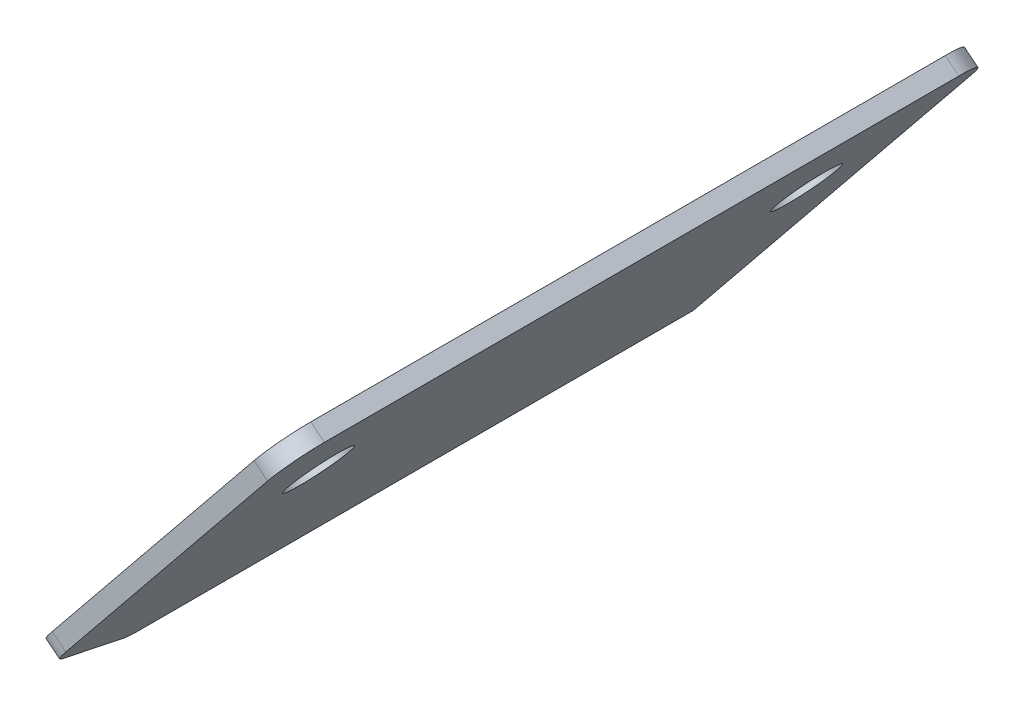
ISO-10303-21;
HEADER;
FILE_DESCRIPTION(('STEP AP214'),'2;1');
FILE_NAME('part.step','',(''),(''),'','','');
FILE_SCHEMA(('AUTOMOTIVE_DESIGN { 1 0 10303 214 1 1 1 1 }'));
ENDSEC;
DATA;
#1=APPLICATION_CONTEXT('core data for automotive mechanical design processes');
#2=APPLICATION_PROTOCOL_DEFINITION('international standard','automotive_design',2000,#1);
#3=PRODUCT_CONTEXT('',#1,'mechanical');
#4=PRODUCT('Part','Part','',(#3));
#5=PRODUCT_RELATED_PRODUCT_CATEGORY('part','',(#4));
#6=PRODUCT_DEFINITION_FORMATION('','',#4);
#7=PRODUCT_DEFINITION_CONTEXT('part definition',#1,'design');
#8=PRODUCT_DEFINITION('design','',#6,#7);
#9=PRODUCT_DEFINITION_SHAPE('','',#8);
#10=(LENGTH_UNIT() NAMED_UNIT(*) SI_UNIT(.MILLI.,.METRE.));
#11=(NAMED_UNIT(*) PLANE_ANGLE_UNIT() SI_UNIT($,.RADIAN.));
#12=(NAMED_UNIT(*) SI_UNIT($,.STERADIAN.) SOLID_ANGLE_UNIT());
#13=UNCERTAINTY_MEASURE_WITH_UNIT(LENGTH_MEASURE(1.E-05),#10,'distance_accuracy_value','');
#14=(GEOMETRIC_REPRESENTATION_CONTEXT(3) GLOBAL_UNCERTAINTY_ASSIGNED_CONTEXT((#13)) GLOBAL_UNIT_ASSIGNED_CONTEXT((#10,
#11,#12)) REPRESENTATION_CONTEXT('',''));
#15=CARTESIAN_POINT('',(0.,0.,0.));
#16=DIRECTION('',(0.,0.,1.));
#17=DIRECTION('',(1.,0.,0.));
#18=AXIS2_PLACEMENT_3D('',#15,#16,#17);
#19=CARTESIAN_POINT('',(-558.37934362098,-537.063221552795,436.626976517199));
#20=DIRECTION('',(0.77686385777956,-0.629668600516065,0.));
#21=DIRECTION('',(0.629668600516065,0.77686385777956,0.));
#22=AXIS2_PLACEMENT_3D('',#19,#20,#21);
#23=PLANE('',#22);
#24=CARTESIAN_POINT('',(-480.886180273954,-441.454773267503,213.995));
#25=DIRECTION('',(-0.77686385777956,0.629668600516065,0.));
#26=DIRECTION('',(-0.629668600516065,-0.77686385777956,0.));
#27=AXIS2_PLACEMENT_3D('',#24,#25,#26);
#28=CIRCLE('',#27,11.1125000000001);
#29=CARTESIAN_POINT('',(-487.883372597189,-450.087672887079,213.995));
#30=VERTEX_POINT('',#29);
#31=EDGE_CURVE('E320',#30,#30,#28,.T.);
#32=ORIENTED_EDGE('',*,*,#31,.F.);
#33=EDGE_LOOP('',(#32));
#34=FACE_BOUND('',#33,.T.);
#35=CARTESIAN_POINT('',(-480.886180273954,-441.454773267503,36.195));
#36=DIRECTION('',(-0.77686385777956,0.629668600516065,0.));
#37=DIRECTION('',(-0.629668600516065,-0.77686385777956,0.));
#38=AXIS2_PLACEMENT_3D('',#35,#36,#37);
#39=CIRCLE('',#38,11.1125000000001);
#40=CARTESIAN_POINT('',(-487.883372597189,-450.087672887079,36.195));
#41=VERTEX_POINT('',#40);
#42=EDGE_CURVE('E185',#41,#41,#39,.T.);
#43=ORIENTED_EDGE('',*,*,#42,.F.);
#44=EDGE_LOOP('',(#43));
#45=FACE_BOUND('',#44,.T.);
#46=DIRECTION('',(0.,0.,-1.));
#47=VECTOR('',#46,1.);
#48=CARTESIAN_POINT('',(-448.899015367738,-401.990089292302,436.626976517199));
#49=LINE('',#48,#47);
#50=CARTESIAN_POINT('',(-448.899015367738,-401.990089292302,243.84));
#51=VERTEX_POINT('',#50);
#52=CARTESIAN_POINT('',(-448.899015367738,-401.990089292302,12.7));
#53=VERTEX_POINT('',#52);
#54=EDGE_CURVE('E140',#51,#53,#49,.T.);
#55=ORIENTED_EDGE('',*,*,#54,.T.);
#56=CARTESIAN_POINT('',(-456.895806594292,-411.856260286102,12.7));
#57=DIRECTION('',(0.77686385777956,-0.629668600516065,0.));
#58=DIRECTION('',(0.629668600516065,0.77686385777956,0.));
#59=AXIS2_PLACEMENT_3D('',#56,#57,#58);
#60=CIRCLE('',#59,12.7);
#61=CARTESIAN_POINT('',(-456.895806594292,-411.856260286102,0.));
#62=VERTEX_POINT('',#61);
#63=EDGE_CURVE('E160',#53,#62,#60,.F.);
#64=ORIENTED_EDGE('',*,*,#63,.T.);
#65=DIRECTION('',(-0.629668600516065,-0.77686385777956,0.));
#66=VECTOR('',#65,1.);
#67=CARTESIAN_POINT('',(-558.37934362098,-537.063221552795,0.));
#68=LINE('',#67,#66);
#69=CARTESIAN_POINT('',(-558.37934362098,-537.063221552795,0.));
#70=VERTEX_POINT('',#69);
#71=EDGE_CURVE('E138',#62,#70,#68,.T.);
#72=ORIENTED_EDGE('',*,*,#71,.T.);
#73=DIRECTION('',(0.,0.,-1.));
#74=VECTOR('',#73,1.);
#75=CARTESIAN_POINT('',(-558.37934362098,-537.063221552795,436.626976517199));
#76=LINE('',#75,#74);
#77=CARTESIAN_POINT('',(-558.37934362098,-537.063221552795,201.506666666667));
#78=VERTEX_POINT('',#77);
#79=EDGE_CURVE('E122',#78,#70,#76,.T.);
#80=ORIENTED_EDGE('',*,*,#79,.F.);
#81=CARTESIAN_POINT('',(-550.382552394426,-527.197050558995,201.506666666667));
#82=DIRECTION('',(0.77686385777956,-0.629668600516065,0.));
#83=DIRECTION('',(0.629668600516065,0.77686385777956,0.));
#84=AXIS2_PLACEMENT_3D('',#81,#82,#83);
#85=CIRCLE('',#84,12.7);
#86=CARTESIAN_POINT('',(-556.779985375669,-535.089987354035,209.126666666667));
#87=VERTEX_POINT('',#86);
#88=EDGE_CURVE('E154',#78,#87,#85,.F.);
#89=ORIENTED_EDGE('',*,*,#88,.T.);
#90=DIRECTION('',(-0.377801160309639,-0.466118314667735,-0.800000000000001));
#91=VECTOR('',#90,1.);
#92=CARTESIAN_POINT('',(-488.595849518114,-450.966702854454,353.507664971008));
#93=LINE('',#92,#91);
#94=CARTESIAN_POINT('',(-536.788007309284,-510.424559869534,251.46));
#95=VERTEX_POINT('',#94);
#96=EDGE_CURVE('E179',#95,#87,#93,.T.);
#97=ORIENTED_EDGE('',*,*,#96,.F.);
#98=CARTESIAN_POINT('',(-530.390574328041,-502.531623074494,243.84));
#99=DIRECTION('',(0.77686385777956,-0.629668600516065,0.));
#100=DIRECTION('',(0.629668600516065,0.77686385777956,0.));
#101=AXIS2_PLACEMENT_3D('',#98,#99,#100);
#102=CIRCLE('',#101,12.7);
#103=CARTESIAN_POINT('',(-530.390574328041,-502.531623074493,256.54));
#104=VERTEX_POINT('',#103);
#105=EDGE_CURVE('E156',#95,#104,#102,.F.);
#106=ORIENTED_EDGE('',*,*,#105,.T.);
#107=DIRECTION('',(-0.629668600516065,-0.77686385777956,0.));
#108=VECTOR('',#107,1.);
#109=CARTESIAN_POINT('',(-558.37934362098,-537.063221552795,256.54));
#110=LINE('',#109,#108);
#111=CARTESIAN_POINT('',(-456.895806594292,-411.856260286102,256.54));
#112=VERTEX_POINT('',#111);
#113=EDGE_CURVE('E132',#112,#104,#110,.T.);
#114=ORIENTED_EDGE('',*,*,#113,.F.);
#115=CARTESIAN_POINT('',(-456.895806594292,-411.856260286102,243.84));
#116=DIRECTION('',(0.77686385777956,-0.629668600516065,0.));
#117=DIRECTION('',(0.629668600516065,0.77686385777956,0.));
#118=AXIS2_PLACEMENT_3D('',#115,#116,#117);
#119=CIRCLE('',#118,12.7);
#120=EDGE_CURVE('E158',#112,#51,#119,.F.);
#121=ORIENTED_EDGE('',*,*,#120,.T.);
#122=EDGE_LOOP('',(#55,#64,#72,#80,#89,#97,#106,#114,#121));
#123=FACE_BOUND('',#122,.T.);
#124=ADVANCED_FACE('F33',(#34,#45,#123),#23,.F.);
#125=CARTESIAN_POINT('',(-553.44625812408,-541.061617166072,436.626976517199));
#126=DIRECTION('',(0.629668600516064,0.77686385777956,0.));
#127=DIRECTION('',(-0.77686385777956,0.629668600516064,0.));
#128=AXIS2_PLACEMENT_3D('',#125,#126,#127);
#129=PLANE('',#128);
#130=DIRECTION('',(0.,0.,-1.));
#131=VECTOR('',#130,1.);
#132=CARTESIAN_POINT('',(-553.44625812408,-541.061617166072,436.626976517199));
#133=LINE('',#132,#131);
#134=CARTESIAN_POINT('',(-553.44625812408,-541.061617166072,201.506666666667));
#135=VERTEX_POINT('',#134);
#136=CARTESIAN_POINT('',(-553.44625812408,-541.061617166072,0.));
#137=VERTEX_POINT('',#136);
#138=EDGE_CURVE('E106',#135,#137,#133,.T.);
#139=ORIENTED_EDGE('',*,*,#138,.F.);
#140=DIRECTION('',(-0.77686385777956,0.629668600516064,0.));
#141=VECTOR('',#140,1.);
#142=CARTESIAN_POINT('',(-558.37934362098,-537.063221552795,201.506666666667));
#143=LINE('',#142,#141);
#144=EDGE_CURVE('E11',#135,#78,#143,.T.);
#145=ORIENTED_EDGE('',*,*,#144,.T.);
#146=ORIENTED_EDGE('',*,*,#79,.T.);
#147=DIRECTION('',(0.77686385777956,-0.629668600516064,0.));
#148=VECTOR('',#147,1.);
#149=CARTESIAN_POINT('',(-553.44625812408,-541.061617166072,0.));
#150=LINE('',#149,#148);
#151=EDGE_CURVE('E117',#70,#137,#150,.T.);
#152=ORIENTED_EDGE('',*,*,#151,.T.);
#153=EDGE_LOOP('',(#139,#145,#146,#152));
#154=FACE_BOUND('',#153,.T.);
#155=ADVANCED_FACE('F120',(#154),#129,.F.);
#156=CARTESIAN_POINT('',(-443.965929870837,-405.988484905579,436.626976517199));
#157=DIRECTION('',(-0.77686385777956,0.629668600516065,0.));
#158=DIRECTION('',(-0.629668600516065,-0.77686385777956,0.));
#159=AXIS2_PLACEMENT_3D('',#156,#157,#158);
#160=PLANE('',#159);
#161=CARTESIAN_POINT('',(-475.953094777053,-445.45316888078,213.995));
#162=DIRECTION('',(-0.77686385777956,0.629668600516065,0.));
#163=DIRECTION('',(-0.629668600516065,-0.77686385777956,0.));
#164=AXIS2_PLACEMENT_3D('',#161,#162,#163);
#165=CIRCLE('',#164,11.1125000000001);
#166=CARTESIAN_POINT('',(-482.950287100288,-454.086068500356,213.995));
#167=VERTEX_POINT('',#166);
#168=EDGE_CURVE('E135',#167,#167,#165,.F.);
#169=ORIENTED_EDGE('',*,*,#168,.F.);
#170=EDGE_LOOP('',(#169));
#171=FACE_BOUND('',#170,.T.);
#172=CARTESIAN_POINT('',(-475.953094777053,-445.45316888078,36.195));
#173=DIRECTION('',(-0.77686385777956,0.629668600516065,0.));
#174=DIRECTION('',(-0.629668600516065,-0.77686385777956,0.));
#175=AXIS2_PLACEMENT_3D('',#172,#173,#174);
#176=CIRCLE('',#175,11.1125000000001);
#177=CARTESIAN_POINT('',(-482.950287100288,-454.086068500356,36.195));
#178=VERTEX_POINT('',#177);
#179=EDGE_CURVE('E319',#178,#178,#176,.F.);
#180=ORIENTED_EDGE('',*,*,#179,.F.);
#181=EDGE_LOOP('',(#180));
#182=FACE_BOUND('',#181,.T.);
#183=DIRECTION('',(0.629668600516065,0.77686385777956,0.));
#184=VECTOR('',#183,1.);
#185=CARTESIAN_POINT('',(-443.965929870837,-405.988484905579,0.));
#186=LINE('',#185,#184);
#187=CARTESIAN_POINT('',(-451.962721097391,-415.854655899379,0.));
#188=VERTEX_POINT('',#187);
#189=EDGE_CURVE('E110',#137,#188,#186,.T.);
#190=ORIENTED_EDGE('',*,*,#189,.T.);
#191=CARTESIAN_POINT('',(-451.962721097391,-415.854655899379,12.7));
#192=DIRECTION('',(-0.77686385777956,0.629668600516065,0.));
#193=DIRECTION('',(-0.629668600516065,-0.77686385777956,0.));
#194=AXIS2_PLACEMENT_3D('',#191,#192,#193);
#195=CIRCLE('',#194,12.7);
#196=CARTESIAN_POINT('',(-443.965929870837,-405.988484905579,12.7));
#197=VERTEX_POINT('',#196);
#198=EDGE_CURVE('E166',#188,#197,#195,.F.);
#199=ORIENTED_EDGE('',*,*,#198,.T.);
#200=DIRECTION('',(0.,0.,-1.));
#201=VECTOR('',#200,1.);
#202=CARTESIAN_POINT('',(-443.965929870837,-405.988484905579,436.626976517199));
#203=LINE('',#202,#201);
#204=CARTESIAN_POINT('',(-443.965929870837,-405.988484905579,243.84));
#205=VERTEX_POINT('',#204);
#206=EDGE_CURVE('E146',#205,#197,#203,.T.);
#207=ORIENTED_EDGE('',*,*,#206,.F.);
#208=CARTESIAN_POINT('',(-451.962721097392,-415.854655899379,243.84));
#209=DIRECTION('',(-0.77686385777956,0.629668600516065,0.));
#210=DIRECTION('',(-0.629668600516065,-0.77686385777956,0.));
#211=AXIS2_PLACEMENT_3D('',#208,#209,#210);
#212=CIRCLE('',#211,12.7);
#213=CARTESIAN_POINT('',(-451.962721097392,-415.854655899379,256.54));
#214=VERTEX_POINT('',#213);
#215=EDGE_CURVE('E48',#205,#214,#212,.F.);
#216=ORIENTED_EDGE('',*,*,#215,.T.);
#217=DIRECTION('',(0.629668600516065,0.77686385777956,0.));
#218=VECTOR('',#217,1.);
#219=CARTESIAN_POINT('',(-443.965929870837,-405.988484905579,256.54));
#220=LINE('',#219,#218);
#221=CARTESIAN_POINT('',(-525.45748883114,-506.530018687771,256.54));
#222=VERTEX_POINT('',#221);
#223=EDGE_CURVE('E130',#222,#214,#220,.T.);
#224=ORIENTED_EDGE('',*,*,#223,.F.);
#225=CARTESIAN_POINT('',(-525.45748883114,-506.530018687771,243.84));
#226=DIRECTION('',(-0.77686385777956,0.629668600516065,0.));
#227=DIRECTION('',(-0.629668600516065,-0.77686385777956,0.));
#228=AXIS2_PLACEMENT_3D('',#225,#226,#227);
#229=CIRCLE('',#228,12.7);
#230=CARTESIAN_POINT('',(-531.854921812384,-514.422955482811,251.46));
#231=VERTEX_POINT('',#230);
#232=EDGE_CURVE('E56',#222,#231,#229,.F.);
#233=ORIENTED_EDGE('',*,*,#232,.T.);
#234=DIRECTION('',(0.377801160309639,0.466118314667735,0.800000000000001));
#235=VECTOR('',#234,1.);
#236=CARTESIAN_POINT('',(-444.249845850047,-406.338770853954,436.965149620054));
#237=LINE('',#236,#235);
#238=CARTESIAN_POINT('',(-551.846899878769,-539.088382967312,209.126666666667));
#239=VERTEX_POINT('',#238);
#240=EDGE_CURVE('E181',#239,#231,#237,.T.);
#241=ORIENTED_EDGE('',*,*,#240,.F.);
#242=CARTESIAN_POINT('',(-545.449466897526,-531.195446172272,201.506666666667));
#243=DIRECTION('',(-0.77686385777956,0.629668600516065,0.));
#244=DIRECTION('',(-0.629668600516065,-0.77686385777956,0.));
#245=AXIS2_PLACEMENT_3D('',#242,#243,#244);
#246=CIRCLE('',#245,12.7);
#247=EDGE_CURVE('E114',#239,#135,#246,.F.);
#248=ORIENTED_EDGE('',*,*,#247,.T.);
#249=ORIENTED_EDGE('',*,*,#138,.T.);
#250=EDGE_LOOP('',(#190,#199,#207,#216,#224,#233,#241,#248,#249));
#251=FACE_BOUND('',#250,.T.);
#252=ADVANCED_FACE('F108',(#171,#182,#251),#160,.F.);
#253=CARTESIAN_POINT('',(101.854,-3057.525,256.54));
#254=DIRECTION('',(0.,0.,1.));
#255=DIRECTION('',(0.,1.,0.));
#256=AXIS2_PLACEMENT_3D('',#253,#254,#255);
#257=PLANE('',#256);
#258=ORIENTED_EDGE('',*,*,#223,.T.);
#259=DIRECTION('',(-0.776863857779568,0.629668600516055,0.));
#260=VECTOR('',#259,1.);
#261=CARTESIAN_POINT('',(-456.895806594292,-411.856260286102,256.54));
#262=LINE('',#261,#260);
#263=EDGE_CURVE('E170',#214,#112,#262,.T.);
#264=ORIENTED_EDGE('',*,*,#263,.T.);
#265=ORIENTED_EDGE('',*,*,#113,.T.);
#266=DIRECTION('',(0.77686385777956,-0.629668600516065,0.));
#267=VECTOR('',#266,1.);
#268=CARTESIAN_POINT('',(1100.99793948235,-1824.8149447945,256.54));
#269=LINE('',#268,#267);
#270=EDGE_CURVE('E168',#104,#222,#269,.T.);
#271=ORIENTED_EDGE('',*,*,#270,.T.);
#272=EDGE_LOOP('',(#258,#264,#265,#271));
#273=FACE_BOUND('',#272,.T.);
#274=ADVANCED_FACE('F189',(#273),#257,.T.);
#275=CARTESIAN_POINT('',(-448.899015367738,-401.990089292302,436.626976517199));
#276=DIRECTION('',(-0.629668600516055,-0.776863857779568,0.));
#277=DIRECTION('',(0.776863857779568,-0.629668600516055,0.));
#278=AXIS2_PLACEMENT_3D('',#275,#276,#277);
#279=PLANE('',#278);
#280=ORIENTED_EDGE('',*,*,#206,.T.);
#281=DIRECTION('',(-0.776863857779568,0.629668600516055,0.));
#282=VECTOR('',#281,1.);
#283=CARTESIAN_POINT('',(-448.899015367738,-401.990089292302,12.7));
#284=LINE('',#283,#282);
#285=EDGE_CURVE('E151',#197,#53,#284,.T.);
#286=ORIENTED_EDGE('',*,*,#285,.T.);
#287=ORIENTED_EDGE('',*,*,#54,.F.);
#288=DIRECTION('',(-0.776863857779568,0.629668600516055,0.));
#289=VECTOR('',#288,1.);
#290=CARTESIAN_POINT('',(-443.965929870838,-405.988484905579,243.84));
#291=LINE('',#290,#289);
#292=EDGE_CURVE('E142',#51,#205,#291,.F.);
#293=ORIENTED_EDGE('',*,*,#292,.T.);
#294=EDGE_LOOP('',(#280,#286,#287,#293));
#295=FACE_BOUND('',#294,.T.);
#296=ADVANCED_FACE('F197',(#295),#279,.F.);
#297=CARTESIAN_POINT('',(-443.965929870837,-405.988484905579,0.));
#298=DIRECTION('',(0.,0.,-1.));
#299=DIRECTION('',(-1.,0.,0.));
#300=AXIS2_PLACEMENT_3D('',#297,#298,#299);
#301=PLANE('',#300);
#302=ORIENTED_EDGE('',*,*,#71,.F.);
#303=DIRECTION('',(-0.776863857779568,0.629668600516055,0.));
#304=VECTOR('',#303,1.);
#305=CARTESIAN_POINT('',(-451.962721097391,-415.854655899379,0.));
#306=LINE('',#305,#304);
#307=EDGE_CURVE('E129',#62,#188,#306,.F.);
#308=ORIENTED_EDGE('',*,*,#307,.T.);
#309=ORIENTED_EDGE('',*,*,#189,.F.);
#310=ORIENTED_EDGE('',*,*,#151,.F.);
#311=EDGE_LOOP('',(#302,#308,#309,#310));
#312=FACE_BOUND('',#311,.T.);
#313=ADVANCED_FACE('F127',(#312),#301,.T.);
#314=CARTESIAN_POINT('',(-409.878713174438,-499.008193969216,213.995));
#315=DIRECTION('',(-0.77686385777956,0.629668600516065,0.));
#316=DIRECTION('',(-0.629668600516065,-0.77686385777956,0.));
#317=AXIS2_PLACEMENT_3D('',#314,#315,#316);
#318=CYLINDRICAL_SURFACE('',#317,11.1125000000001);
#319=ORIENTED_EDGE('',*,*,#31,.T.);
#320=EDGE_LOOP('',(#319));
#321=FACE_BOUND('',#320,.T.);
#322=ORIENTED_EDGE('',*,*,#168,.T.);
#323=EDGE_LOOP('',(#322));
#324=FACE_BOUND('',#323,.T.);
#325=ADVANCED_FACE('F234',(#321,#324),#318,.F.);
#326=CARTESIAN_POINT('',(-409.878713174438,-499.008193969216,36.195));
#327=DIRECTION('',(-0.77686385777956,0.629668600516065,0.));
#328=DIRECTION('',(-0.629668600516065,-0.77686385777956,0.));
#329=AXIS2_PLACEMENT_3D('',#326,#327,#328);
#330=CYLINDRICAL_SURFACE('',#329,11.1125000000001);
#331=ORIENTED_EDGE('',*,*,#42,.T.);
#332=EDGE_LOOP('',(#331));
#333=FACE_BOUND('',#332,.T.);
#334=ORIENTED_EDGE('',*,*,#179,.T.);
#335=EDGE_LOOP('',(#334));
#336=FACE_BOUND('',#335,.T.);
#337=ADVANCED_FACE('F237',(#333,#336),#330,.F.);
#338=CARTESIAN_POINT('',(-249.071839619087,-787.765093217488,205.74));
#339=DIRECTION('',(-0.503734880412852,-0.621491086223648,0.599999999999999));
#340=DIRECTION('',(0.,-0.694558351611311,-0.719436373981034));
#341=AXIS2_PLACEMENT_3D('',#338,#339,#340);
#342=PLANE('',#341);
#343=ORIENTED_EDGE('',*,*,#240,.T.);
#344=DIRECTION('',(0.77686385777956,-0.629668600516065,0.));
#345=VECTOR('',#344,1.);
#346=CARTESIAN_POINT('',(-227.480503307391,-761.126431534226,251.46));
#347=LINE('',#346,#345);
#348=EDGE_CURVE('E41',#231,#95,#347,.F.);
#349=ORIENTED_EDGE('',*,*,#348,.T.);
#350=ORIENTED_EDGE('',*,*,#96,.T.);
#351=DIRECTION('',(-0.776863857779561,0.629668600516064,0.));
#352=VECTOR('',#351,1.);
#353=CARTESIAN_POINT('',(-551.846899878769,-539.088382967312,209.126666666667));
#354=LINE('',#353,#352);
#355=EDGE_CURVE('E173',#87,#239,#354,.F.);
#356=ORIENTED_EDGE('',*,*,#355,.T.);
#357=EDGE_LOOP('',(#343,#349,#350,#356));
#358=FACE_BOUND('',#357,.T.);
#359=ADVANCED_FACE('F178',(#358),#342,.T.);
#360=CARTESIAN_POINT('',(-456.895806594292,-411.856260286102,12.7));
#361=DIRECTION('',(0.776863857779568,-0.629668600516055,0.));
#362=DIRECTION('',(0.629668600516055,0.776863857779568,0.));
#363=AXIS2_PLACEMENT_3D('',#360,#361,#362);
#364=CYLINDRICAL_SURFACE('',#363,12.7);
#365=ORIENTED_EDGE('',*,*,#198,.F.);
#366=ORIENTED_EDGE('',*,*,#307,.F.);
#367=ORIENTED_EDGE('',*,*,#63,.F.);
#368=ORIENTED_EDGE('',*,*,#285,.F.);
#369=EDGE_LOOP('',(#365,#366,#367,#368));
#370=FACE_BOUND('',#369,.T.);
#371=ADVANCED_FACE('F194',(#370),#364,.T.);
#372=CARTESIAN_POINT('',(1174.4927072161,-1734.13958200607,243.84));
#373=DIRECTION('',(0.776863857779568,-0.629668600516055,0.));
#374=DIRECTION('',(0.629668600516055,0.776863857779568,0.));
#375=AXIS2_PLACEMENT_3D('',#372,#373,#374);
#376=CYLINDRICAL_SURFACE('',#375,12.7);
#377=ORIENTED_EDGE('',*,*,#215,.F.);
#378=ORIENTED_EDGE('',*,*,#292,.F.);
#379=ORIENTED_EDGE('',*,*,#120,.F.);
#380=ORIENTED_EDGE('',*,*,#263,.F.);
#381=EDGE_LOOP('',(#377,#378,#379,#380));
#382=FACE_BOUND('',#381,.T.);
#383=ADVANCED_FACE('F201',(#382),#376,.T.);
#384=CARTESIAN_POINT('',(1100.99793948235,-1824.8149447945,243.84));
#385=DIRECTION('',(0.77686385777956,-0.629668600516065,0.));
#386=DIRECTION('',(0.629668600516065,0.77686385777956,0.));
#387=AXIS2_PLACEMENT_3D('',#384,#385,#386);
#388=CYLINDRICAL_SURFACE('',#387,12.7);
#389=ORIENTED_EDGE('',*,*,#105,.F.);
#390=ORIENTED_EDGE('',*,*,#348,.F.);
#391=ORIENTED_EDGE('',*,*,#232,.F.);
#392=ORIENTED_EDGE('',*,*,#270,.F.);
#393=EDGE_LOOP('',(#389,#390,#391,#392));
#394=FACE_BOUND('',#393,.T.);
#395=ADVANCED_FACE('F187',(#394),#388,.T.);
#396=CARTESIAN_POINT('',(-545.449466897525,-531.195446172272,201.506666666667));
#397=DIRECTION('',(0.776863857779561,-0.629668600516064,0.));
#398=DIRECTION('',(0.629668600516064,0.77686385777956,0.));
#399=AXIS2_PLACEMENT_3D('',#396,#397,#398);
#400=CYLINDRICAL_SURFACE('',#399,12.7);
#401=ORIENTED_EDGE('',*,*,#247,.F.);
#402=ORIENTED_EDGE('',*,*,#355,.F.);
#403=ORIENTED_EDGE('',*,*,#88,.F.);
#404=ORIENTED_EDGE('',*,*,#144,.F.);
#405=EDGE_LOOP('',(#401,#402,#403,#404));
#406=FACE_BOUND('',#405,.T.);
#407=ADVANCED_FACE('F35',(#406),#400,.T.);
#408=CLOSED_SHELL('',(#124,#155,#252,#274,#296,#313,#325,#337,#359,#371,#383,#395,#407));
#409=MANIFOLD_SOLID_BREP('B2',#408);
#410=ADVANCED_BREP_SHAPE_REPRESENTATION('',(#18,#409),#14);
#411=SHAPE_DEFINITION_REPRESENTATION(#9,#410);
ENDSEC;
END-ISO-10303-21;
